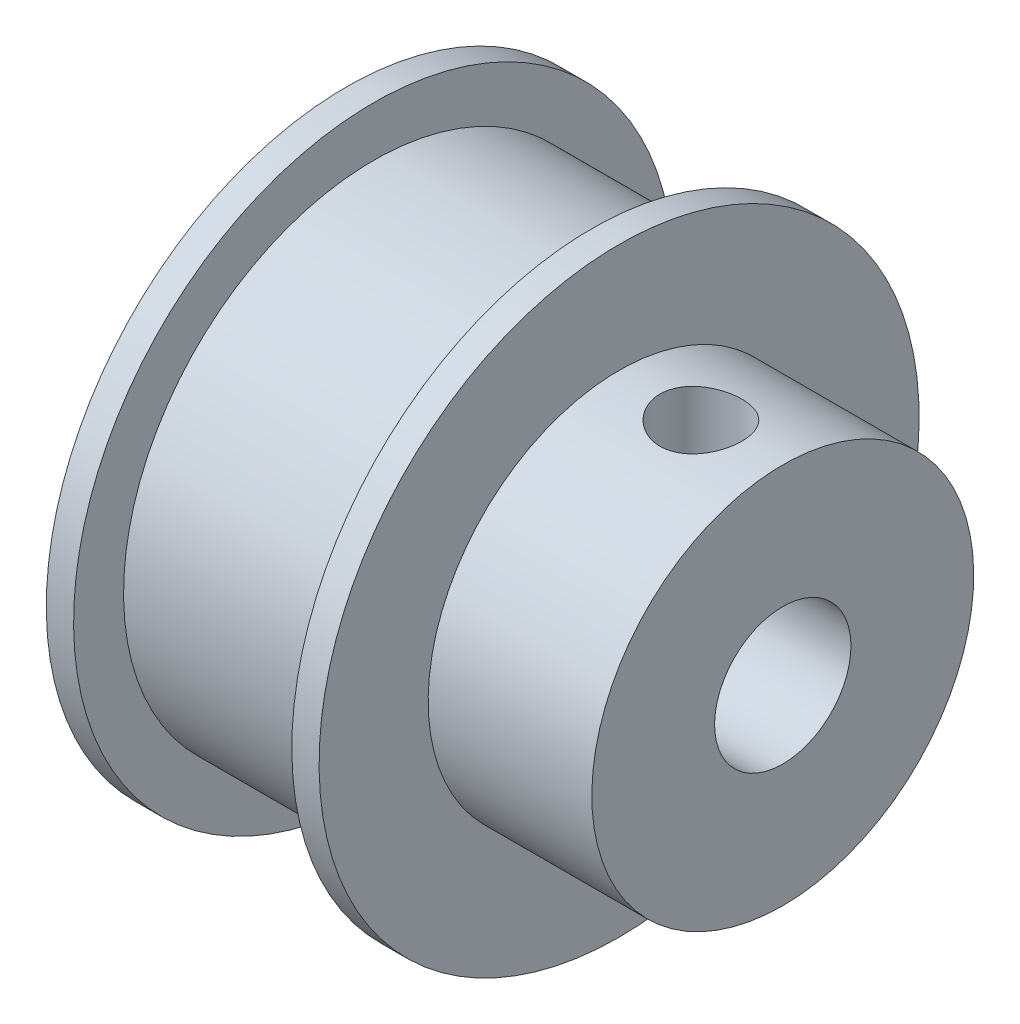
ISO-10303-21;
HEADER;
FILE_DESCRIPTION(('STEP AP214'),'2;1');
FILE_NAME('part.step','',(''),(''),'','','');
FILE_SCHEMA(('AUTOMOTIVE_DESIGN { 1 0 10303 214 1 1 1 1 }'));
ENDSEC;
DATA;
#1=APPLICATION_CONTEXT('core data for automotive mechanical design processes');
#2=APPLICATION_PROTOCOL_DEFINITION('international standard','automotive_design',2000,#1);
#3=PRODUCT_CONTEXT('',#1,'mechanical');
#4=PRODUCT('Part','Part','',(#3));
#5=PRODUCT_RELATED_PRODUCT_CATEGORY('part','',(#4));
#6=PRODUCT_DEFINITION_FORMATION('','',#4);
#7=PRODUCT_DEFINITION_CONTEXT('part definition',#1,'design');
#8=PRODUCT_DEFINITION('design','',#6,#7);
#9=PRODUCT_DEFINITION_SHAPE('','',#8);
#10=(LENGTH_UNIT() NAMED_UNIT(*) SI_UNIT(.MILLI.,.METRE.));
#11=(NAMED_UNIT(*) PLANE_ANGLE_UNIT() SI_UNIT($,.RADIAN.));
#12=(NAMED_UNIT(*) SI_UNIT($,.STERADIAN.) SOLID_ANGLE_UNIT());
#13=UNCERTAINTY_MEASURE_WITH_UNIT(LENGTH_MEASURE(1.E-05),#10,'distance_accuracy_value','');
#14=(GEOMETRIC_REPRESENTATION_CONTEXT(3) GLOBAL_UNCERTAINTY_ASSIGNED_CONTEXT((#13)) GLOBAL_UNIT_ASSIGNED_CONTEXT((#10,
#11,#12)) REPRESENTATION_CONTEXT('',''));
#15=CARTESIAN_POINT('',(0.,0.,0.));
#16=DIRECTION('',(0.,0.,1.));
#17=DIRECTION('',(1.,0.,0.));
#18=AXIS2_PLACEMENT_3D('',#15,#16,#17);
#19=CARTESIAN_POINT('',(16.0077,11.0077,11.007649774016));
#20=DIRECTION('',(-1.,0.,0.));
#21=DIRECTION('',(0.,-1.,0.));
#22=AXIS2_PLACEMENT_3D('',#19,#20,#21);
#23=PLANE('',#22);
#24=CARTESIAN_POINT('',(16.0077,11.0077,11.007649774016));
#25=DIRECTION('',(-1.,0.,0.));
#26=DIRECTION('',(0.,-1.,0.));
#27=AXIS2_PLACEMENT_3D('',#24,#25,#26);
#28=CIRCLE('',#27,2.5);
#29=CARTESIAN_POINT('',(16.0077,8.5077,11.007649774016));
#30=VERTEX_POINT('',#29);
#31=EDGE_CURVE('E17',#30,#30,#28,.F.);
#32=ORIENTED_EDGE('',*,*,#31,.F.);
#33=EDGE_LOOP('',(#32));
#34=FACE_BOUND('',#33,.T.);
#35=CARTESIAN_POINT('',(16.0077,11.0077,11.007649774016));
#36=DIRECTION('',(-1.,0.,0.));
#37=DIRECTION('',(0.,-1.,0.));
#38=AXIS2_PLACEMENT_3D('',#35,#36,#37);
#39=CIRCLE('',#38,7.);
#40=CARTESIAN_POINT('',(16.0077,4.0077,11.007649774016));
#41=VERTEX_POINT('',#40);
#42=EDGE_CURVE('E54',#41,#41,#39,.T.);
#43=ORIENTED_EDGE('',*,*,#42,.F.);
#44=EDGE_LOOP('',(#43));
#45=FACE_BOUND('',#44,.T.);
#46=ADVANCED_FACE('F13',(#34,#45),#23,.F.);
#47=CARTESIAN_POINT('',(13.0077,18.0077,11.007649774016));
#48=DIRECTION('',(0.,-1.,0.));
#49=DIRECTION('',(0.,0.,-1.));
#50=AXIS2_PLACEMENT_3D('',#47,#48,#49);
#51=CYLINDRICAL_SURFACE('',#50,1.5);
#52=CARTESIAN_POINT('',(11.5077,18.0077,11.007649774016));
#53=CARTESIAN_POINT('',(11.5077040616329,18.0076979158203,10.9245031964725));
#54=CARTESIAN_POINT('',(11.5146433516276,18.0062019794075,10.8412548351576));
#55=CARTESIAN_POINT('',(11.5422101351377,18.0003737217559,10.6770511501405));
#56=CARTESIAN_POINT('',(11.5628643761845,17.9960358582811,10.5961006301142));
#57=CARTESIAN_POINT('',(11.6171882271792,17.9850075156425,10.4389922217525));
#58=CARTESIAN_POINT('',(11.6508383681662,17.9783205569708,10.3628273616013));
#59=CARTESIAN_POINT('',(11.7301467464749,17.9633187697261,10.2172515725692));
#60=CARTESIAN_POINT('',(11.7758012455401,17.9550044481331,10.1478385503125));
#61=CARTESIAN_POINT('',(11.8785789047546,17.9375139278232,10.016626975165));
#62=CARTESIAN_POINT('',(11.9358531333075,17.928327326067,9.95494811933814));
#63=CARTESIAN_POINT('',(12.059922718787,17.9102011803762,9.84199205710669));
#64=CARTESIAN_POINT('',(12.1267194075848,17.9012616712107,9.79071630818108));
#65=CARTESIAN_POINT('',(12.2688060531835,17.8845411249014,9.69950755199408));
#66=CARTESIAN_POINT('',(12.344178147649,17.8767732986043,9.65969986222468));
#67=CARTESIAN_POINT('',(12.5007351303334,17.8634232089553,9.59336131193178));
#68=CARTESIAN_POINT('',(12.5819193037601,17.8578406773918,9.5668288219679));
#69=CARTESIAN_POINT('',(12.7465110264519,17.849598092299,9.52818404486148));
#70=CARTESIAN_POINT('',(12.8298671533579,17.8468955729071,9.51586199436955));
#71=CARTESIAN_POINT('',(12.997504109287,17.8445913979369,9.50533581953319));
#72=CARTESIAN_POINT('',(13.081784829579,17.8449893815645,9.50713005252928));
#73=CARTESIAN_POINT('',(13.2473243868107,17.8488027590592,9.52461647726507));
#74=CARTESIAN_POINT('',(13.3286102915488,17.8521653920302,9.5400656682123));
#75=CARTESIAN_POINT('',(13.4874096692655,17.8614458901697,9.5840390267379));
#76=CARTESIAN_POINT('',(13.5649229102641,17.8673639122478,9.61256399722121));
#77=CARTESIAN_POINT('',(13.714665573432,17.881141056491,9.68210549661695));
#78=CARTESIAN_POINT('',(13.7868497022893,17.8890147777161,9.72321654188413));
#79=CARTESIAN_POINT('',(13.923379811785,17.9058063671576,9.81669355832473));
#80=CARTESIAN_POINT('',(13.987725326843,17.9147242973338,9.86906019752274));
#81=CARTESIAN_POINT('',(14.1081465904722,17.9328252701469,9.98484177676397));
#82=CARTESIAN_POINT('',(14.164025192974,17.94200999451,10.0484616685418));
#83=CARTESIAN_POINT('',(14.2643751179751,17.9594466989421,10.1843033079118));
#84=CARTESIAN_POINT('',(14.3088414656964,17.967698271362,10.2565287867927));
#85=CARTESIAN_POINT('',(14.3851480171703,17.9823650392561,10.4077865060949));
#86=CARTESIAN_POINT('',(14.4169530610728,17.9887751074254,10.486836969534));
#87=CARTESIAN_POINT('',(14.4667123206038,17.9989885561534,10.6492278042405));
#88=CARTESIAN_POINT('',(14.4846955529901,18.0027973957049,10.7325587944069));
#89=CARTESIAN_POINT('',(14.4995643489133,18.0059604833547,10.8483901194094));
#90=CARTESIAN_POINT('',(14.5026125156616,18.0066113029207,10.8801576267083));
#91=CARTESIAN_POINT('',(14.5066811224727,18.0074814616371,10.9438283474738));
#92=CARTESIAN_POINT('',(14.507701559175,18.0077008000725,10.9757315611653));
#93=CARTESIAN_POINT('',(14.5076959383671,18.0076979158203,11.0907963515595));
#94=CARTESIAN_POINT('',(14.5007566483724,18.0062019794075,11.1740447128744));
#95=CARTESIAN_POINT('',(14.4731898648623,18.0003737217559,11.3382483978915));
#96=CARTESIAN_POINT('',(14.4525356238155,17.9960358582811,11.4191989179178));
#97=CARTESIAN_POINT('',(14.3982117728208,17.9850075156425,11.5763073262795));
#98=CARTESIAN_POINT('',(14.3645616318338,17.9783205569708,11.6524721864307));
#99=CARTESIAN_POINT('',(14.2852532535251,17.9633187697261,11.7980479754628));
#100=CARTESIAN_POINT('',(14.2395987544599,17.9550044481331,11.8674609977195));
#101=CARTESIAN_POINT('',(14.1368210952454,17.9375139278232,11.998672572867));
#102=CARTESIAN_POINT('',(14.0795468666925,17.928327326067,12.0603514286939));
#103=CARTESIAN_POINT('',(13.955477281213,17.9102011803762,12.1733074909253));
#104=CARTESIAN_POINT('',(13.8886805924152,17.9012616712107,12.2245832398509));
#105=CARTESIAN_POINT('',(13.7465939468165,17.8845411249014,12.3157919960379));
#106=CARTESIAN_POINT('',(13.671221852351,17.8767732986043,12.3555996858073));
#107=CARTESIAN_POINT('',(13.5146648696666,17.8634232089553,12.4219382361002));
#108=CARTESIAN_POINT('',(13.4334806962399,17.8578406773918,12.4484707260641));
#109=CARTESIAN_POINT('',(13.2688889735481,17.849598092299,12.4871155031705));
#110=CARTESIAN_POINT('',(13.1855328466421,17.8468955729071,12.4994375536624));
#111=CARTESIAN_POINT('',(13.017895890713,17.8445913979369,12.5099637284988));
#112=CARTESIAN_POINT('',(12.9336151704211,17.8449893815645,12.5081694955027));
#113=CARTESIAN_POINT('',(12.7680756131893,17.8488027590592,12.4906830707669));
#114=CARTESIAN_POINT('',(12.6867897084512,17.8521653920302,12.4752338798197));
#115=CARTESIAN_POINT('',(12.5279903307345,17.8614458901697,12.4312605212941));
#116=CARTESIAN_POINT('',(12.4504770897359,17.8673639122478,12.4027355508108));
#117=CARTESIAN_POINT('',(12.300734426568,17.881141056491,12.333194051415));
#118=CARTESIAN_POINT('',(12.2285502977107,17.8890147777161,12.2920830061479));
#119=CARTESIAN_POINT('',(12.092020188215,17.9058063671576,12.1986059897073));
#120=CARTESIAN_POINT('',(12.027674673157,17.9147242973338,12.1462393505093));
#121=CARTESIAN_POINT('',(11.9072534095278,17.9328252701469,12.030457771268));
#122=CARTESIAN_POINT('',(11.851374807026,17.94200999451,11.9668378794902));
#123=CARTESIAN_POINT('',(11.7510248820249,17.9594466989421,11.8309962401202));
#124=CARTESIAN_POINT('',(11.7065585343036,17.967698271362,11.7587707612393));
#125=CARTESIAN_POINT('',(11.6302519828297,17.9823650392561,11.6075130419371));
#126=CARTESIAN_POINT('',(11.5984469389272,17.9887751074254,11.528462578498));
#127=CARTESIAN_POINT('',(11.5486876793962,17.9989885561534,11.3660717437915));
#128=CARTESIAN_POINT('',(11.5307044470099,18.0027973957049,11.2827407536251));
#129=CARTESIAN_POINT('',(11.5158356510867,18.0059604833547,11.1669094286226));
#130=CARTESIAN_POINT('',(11.5127874843384,18.0066113029207,11.1351419213237));
#131=CARTESIAN_POINT('',(11.5087188775273,18.0074814616371,11.0714712005582));
#132=CARTESIAN_POINT('',(11.507698440825,18.0077008000725,11.0395679868667));
#133=CARTESIAN_POINT('',(11.5077,18.0077,11.007649774016));
#134=B_SPLINE_CURVE_WITH_KNOTS('',3,(#52,#53,#54,#55,#56,#57,#58,#59,#60,#61,#62,#63,#64,#65,
#66,#67,#68,#69,#70,#71,#72,#73,#74,#75,#76,#77,#78,#79,#80,#81,#82,#83,#84,#85,#86,#87,#88,#89,
#90,#91,#92,#93,#94,#95,#96,#97,#98,#99,#100,#101,#102,#103,#104,#105,#106,#107,#108,#109,#110,
#111,#112,#113,#114,#115,#116,#117,#118,#119,#120,#121,#122,#123,#124,#125,#126,#127,#128,#129,
#130,#131,#132,#133),.UNSPECIFIED.,.T.,.F.,(4,2,2,2,2,2,2,2,2,2,2,2,2,2,2,2,2,2,2,2,2,2,2,2,2,2,
2,2,2,2,2,2,2,2,2,2,2,2,2,2,4),(0.,0.249317611112429,0.499122886646075,0.748555375291559,
0.997910280399726,1.25074283188275,1.50361078087366,1.75914535611344,2.01464855852494,
2.26632989937654,2.51798195343823,2.7652438496878,3.01252093083651,3.26170250920425,
3.51089888069668,3.76521690193803,4.01964559675176,4.27477598038629,4.5293692830717,
4.62507688314403,4.72078464182782,4.97010225294025,5.2199075284739,5.46934001711938,
5.71869492222755,5.97152747371058,6.22439542270148,6.47992999794126,6.73543320035276,
6.98711454120436,7.23876659526606,7.48602849151562,7.73330557266433,7.98248715103208,
8.2316835225245,8.48600154376585,8.74043023857958,8.9955606222141,9.25015392489952,
9.34586152497186,9.44156928365565),.UNSPECIFIED.);
#135=CARTESIAN_POINT('',(11.5077,18.0077,11.007649774016));
#136=VERTEX_POINT('',#135);
#137=EDGE_CURVE('E46',#136,#136,#134,.T.);
#138=ORIENTED_EDGE('',*,*,#137,.F.);
#139=EDGE_LOOP('',(#138));
#140=FACE_BOUND('',#139,.T.);
#141=CARTESIAN_POINT('',(11.5077,13.5077,11.007649774016));
#142=CARTESIAN_POINT('',(11.5077040910099,13.5076962578973,11.084379607478));
#143=CARTESIAN_POINT('',(11.5136286709263,13.5041290461501,11.1612320946602));
#144=CARTESIAN_POINT('',(11.5370243195153,13.4901990360857,11.3126252835467));
#145=CARTESIAN_POINT('',(11.5545238618542,13.4798194803272,11.387159808612));
#146=CARTESIAN_POINT('',(11.6000863611669,13.4533155805449,11.5314016018068));
#147=CARTESIAN_POINT('',(11.6280969581632,13.4372197327294,11.6011308022426));
#148=CARTESIAN_POINT('',(11.693560333141,13.4006536762641,11.7346800922307));
#149=CARTESIAN_POINT('',(11.7310107669687,13.3801845538026,11.7985016434324));
#150=CARTESIAN_POINT('',(11.8174748267086,13.3347536071909,11.9239490530153));
#151=CARTESIAN_POINT('',(11.8671536953514,13.3095679219599,11.9850337940974));
#152=CARTESIAN_POINT('',(11.9751672038283,13.2580043927963,12.0985324781349));
#153=CARTESIAN_POINT('',(12.0335129371873,13.2316250515357,12.1509351234971));
#154=CARTESIAN_POINT('',(12.1656235104967,13.1768106699591,12.2520997416457));
#155=CARTESIAN_POINT('',(12.2404017709813,13.1485201770365,12.2996274378041));
#156=CARTESIAN_POINT('',(12.3985465732431,13.0970830141212,12.381264151665));
#157=CARTESIAN_POINT('',(12.4818988962476,13.0739280227394,12.4153949473676));
#158=CARTESIAN_POINT('',(12.6342964506532,13.0412462966093,12.4620557911582));
#159=CARTESIAN_POINT('',(12.7019359986103,13.0297788313759,12.4778117464843));
#160=CARTESIAN_POINT('',(12.8395037158304,13.013603082955,12.4998114974207));
#161=CARTESIAN_POINT('',(12.9094289287545,13.0088863964376,12.5060671195844));
#162=CARTESIAN_POINT('',(13.0497114942173,13.0069092246386,12.5087048619761));
#163=CARTESIAN_POINT('',(13.1200694250932,13.0096633701272,12.5050676081002));
#164=CARTESIAN_POINT('',(13.2589787754276,13.0222326144374,12.4881103788043));
#165=CARTESIAN_POINT('',(13.3275287958474,13.0320530243223,12.474783120217));
#166=CARTESIAN_POINT('',(13.4602302421281,13.0572318694426,12.4393889928339));
#167=CARTESIAN_POINT('',(13.5244270539245,13.0725171165254,12.4174372606769));
#168=CARTESIAN_POINT('',(13.6483949909281,13.1069705135083,12.3656003917244));
#169=CARTESIAN_POINT('',(13.7081644834239,13.1261400862346,12.335712346613));
#170=CARTESIAN_POINT('',(13.8326840971228,13.1702532726899,12.2628296058618));
#171=CARTESIAN_POINT('',(13.8964780929549,13.1956204337299,12.2184570179932));
#172=CARTESIAN_POINT('',(14.016376483667,13.2470059976438,12.120560701856));
#173=CARTESIAN_POINT('',(14.0724734339765,13.2730250026215,12.0670282250218));
#174=CARTESIAN_POINT('',(14.1833129818218,13.3270550495832,11.943461608399));
#175=CARTESIAN_POINT('',(14.236777306016,13.3548383626853,11.872167456721));
#176=CARTESIAN_POINT('',(14.3308220471979,13.4054242843398,11.719925824475));
#177=CARTESIAN_POINT('',(14.37140935379,13.4282295542552,11.6389835379596));
#178=CARTESIAN_POINT('',(14.4356321827959,13.4650039206615,11.4748473592842));
#179=CARTESIAN_POINT('',(14.4601753557159,13.479439574397,11.3921173981896));
#180=CARTESIAN_POINT('',(14.4947111974054,13.4998884281355,11.2226976691606));
#181=CARTESIAN_POINT('',(14.5047213177536,13.5059117295274,11.1360127796773));
#182=CARTESIAN_POINT('',(14.5092078476783,13.5086057037461,10.9739351596386));
#183=CARTESIAN_POINT('',(14.5056088550852,13.5064352171429,10.8986073005973));
#184=CARTESIAN_POINT('',(14.4872741469281,13.4954871208705,10.7498203720299));
#185=CARTESIAN_POINT('',(14.4725386571942,13.4867096451804,10.6763612646399));
#186=CARTESIAN_POINT('',(14.4331565671875,13.4636479244219,10.5350748418584));
#187=CARTESIAN_POINT('',(14.4087596509265,13.4495027566256,10.4671540230875));
#188=CARTESIAN_POINT('',(14.3510226236347,13.4168388086284,10.3363840249287));
#189=CARTESIAN_POINT('',(14.3176807486533,13.3983191658651,10.2735358490521));
#190=CARTESIAN_POINT('',(14.2391430207913,13.3561549623736,10.1476435111921));
#191=CARTESIAN_POINT('',(14.1930761709216,13.3321780273988,10.0852556235592));
#192=CARTESIAN_POINT('',(14.0923086065114,13.2824426557473,9.96862374270586));
#193=CARTESIAN_POINT('',(14.0375978451475,13.2566821658636,9.91438937127862));
#194=CARTESIAN_POINT('',(13.9127896099629,13.2021542390989,9.80832980666021));
#195=CARTESIAN_POINT('',(13.8416161145345,13.1734324174629,9.75773957770685));
#196=CARTESIAN_POINT('',(13.6904839754318,13.1198618206671,9.66919738485933));
#197=CARTESIAN_POINT('',(13.6105347061072,13.0950089799769,9.63123210631819));
#198=CARTESIAN_POINT('',(13.4614569776933,13.0575490924052,9.57622398605824));
#199=CARTESIAN_POINT('',(13.3937196876414,13.0434565932873,9.5564335206541));
#200=CARTESIAN_POINT('',(13.2551679219199,13.0217960574354,9.52651313495628));
#201=CARTESIAN_POINT('',(13.1843578556722,13.0142189764272,9.51636982103969));
#202=CARTESIAN_POINT('',(13.041323052403,13.0067044661627,9.50630846984969));
#203=CARTESIAN_POINT('',(12.969094009313,13.0067957644594,9.50642888293731));
#204=CARTESIAN_POINT('',(12.8258055643905,13.0146771789285,9.51698504442272));
#205=CARTESIAN_POINT('',(12.7547468199194,13.0224714813882,9.52742640185841));
#206=CARTESIAN_POINT('',(12.6192115824278,13.0440318524298,9.55724803252687));
#207=CARTESIAN_POINT('',(12.5545829056931,13.0574921180558,9.57617340556249));
#208=CARTESIAN_POINT('',(12.4293627455258,13.0887550196015,9.62201735324607));
#209=CARTESIAN_POINT('',(12.3687727930394,13.1065592904048,9.64893893813121));
#210=CARTESIAN_POINT('',(12.2433801427792,13.1478299055092,9.71475731845868));
#211=CARTESIAN_POINT('',(12.1793588961457,13.1717458758264,9.75485809725847));
#212=CARTESIAN_POINT('',(12.0583199273827,13.2209012703077,9.84389279012516));
#213=CARTESIAN_POINT('',(12.0013080378474,13.2461417720502,9.89283397793802));
#214=CARTESIAN_POINT('',(11.8863490508683,13.2999569029148,10.0075519997587));
#215=CARTESIAN_POINT('',(11.8297689251038,13.3284030866366,10.0747729547021));
#216=CARTESIAN_POINT('',(11.7286021441367,13.3813542887237,10.2191873395704));
#217=CARTESIAN_POINT('',(11.6840197880152,13.4058578931094,10.2963843295145));
#218=CARTESIAN_POINT('',(11.6099141924263,13.4475557865439,10.4565245432146));
#219=CARTESIAN_POINT('',(11.5799719350732,13.4649507747979,10.5392196870588));
#220=CARTESIAN_POINT('',(11.534975304789,13.4913627300125,10.7096764678972));
#221=CARTESIAN_POINT('',(11.519864832143,13.5004112587149,10.7974176743674));
#222=CARTESIAN_POINT('',(11.5110025452913,13.5057200116819,10.9060916770985));
#223=CARTESIAN_POINT('',(11.5097655826939,13.5064611465636,10.9263735149877));
#224=CARTESIAN_POINT('',(11.5081137536291,13.5074516451737,10.9669839533289));
#225=CARTESIAN_POINT('',(11.5076989156791,13.5077009918432,10.9873125553784));
#226=CARTESIAN_POINT('',(11.5077,13.5077,11.007649774016));
#227=B_SPLINE_CURVE_WITH_KNOTS('',3,(#141,#142,#143,#144,#145,#146,#147,#148,#149,#150,#151,
#152,#153,#154,#155,#156,#157,#158,#159,#160,#161,#162,#163,#164,#165,#166,#167,#168,#169,#170,
#171,#172,#173,#174,#175,#176,#177,#178,#179,#180,#181,#182,#183,#184,#185,#186,#187,#188,#189,
#190,#191,#192,#193,#194,#195,#196,#197,#198,#199,#200,#201,#202,#203,#204,#205,#206,#207,#208,
#209,#210,#211,#212,#213,#214,#215,#216,#217,#218,#219,#220,#221,#222,#223,#224,#225,#226),
.UNSPECIFIED.,.T.,.F.,(4,2,2,2,2,2,2,2,2,2,2,2,2,2,2,2,2,2,2,2,2,2,2,2,2,2,2,2,2,2,2,2,2,2,2,2,
2,2,2,2,2,2,4),(0.,0.230102237548648,0.460772627520011,0.690308884600007,0.919788197992273,
1.16681590732472,1.414162579348,1.69183813189807,1.96906040692092,2.17933829855633,
2.38935420916578,2.59978170870726,2.81036753273872,3.01823267593207,3.22617409809869,
3.47046995225163,3.71500044803674,3.99360957884691,4.27206939275325,4.5329679069656,
4.79355286918236,5.01875602722426,5.24395461863455,5.46367785689772,5.68344445659025,
5.92601365818362,6.16886690081836,6.44336762428009,6.71757792616456,6.93257787314692,
7.14727888733319,7.36278425777433,7.57840681155725,7.78364098331142,7.98895251523035,
8.22578610052286,8.46281544370208,8.73854311775519,9.01436946031986,9.28175654462677,
9.54812832184449,9.60911473335177,9.6701032602764),.UNSPECIFIED.);
#228=CARTESIAN_POINT('',(11.5077,13.5077,11.007649774016));
#229=VERTEX_POINT('',#228);
#230=EDGE_CURVE('E116',#229,#229,#227,.T.);
#231=ORIENTED_EDGE('',*,*,#230,.F.);
#232=EDGE_LOOP('',(#231));
#233=FACE_BOUND('',#232,.T.);
#234=ADVANCED_FACE('F55',(#140,#233),#51,.F.);
#235=CARTESIAN_POINT('',(1.0077,11.0077,11.007649774016));
#236=DIRECTION('',(-1.,0.,0.));
#237=DIRECTION('',(0.,-1.,0.));
#238=AXIS2_PLACEMENT_3D('',#235,#236,#237);
#239=CYLINDRICAL_SURFACE('',#238,2.5);
#240=ORIENTED_EDGE('',*,*,#31,.T.);
#241=EDGE_LOOP('',(#240));
#242=FACE_BOUND('',#241,.T.);
#243=CARTESIAN_POINT('',(0.00769999999999981,11.0077,11.007649774016));
#244=DIRECTION('',(-1.,0.,0.));
#245=DIRECTION('',(0.,-1.,0.));
#246=AXIS2_PLACEMENT_3D('',#243,#244,#245);
#247=CIRCLE('',#246,2.5);
#248=CARTESIAN_POINT('',(0.00770000000000009,8.5077,11.007649774016));
#249=VERTEX_POINT('',#248);
#250=EDGE_CURVE('E43',#249,#249,#247,.F.);
#251=ORIENTED_EDGE('',*,*,#250,.F.);
#252=EDGE_LOOP('',(#251));
#253=FACE_BOUND('',#252,.T.);
#254=ORIENTED_EDGE('',*,*,#230,.T.);
#255=EDGE_LOOP('',(#254));
#256=FACE_BOUND('',#255,.T.);
#257=ADVANCED_FACE('F63',(#242,#253,#256),#239,.F.);
#258=CARTESIAN_POINT('',(16.0077,11.0077,11.007649774016));
#259=DIRECTION('',(-1.,0.,0.));
#260=DIRECTION('',(0.,-1.,0.));
#261=AXIS2_PLACEMENT_3D('',#258,#259,#260);
#262=CYLINDRICAL_SURFACE('',#261,7.);
#263=CARTESIAN_POINT('',(10.0077,11.0077,11.007649774016));
#264=DIRECTION('',(-1.,0.,0.));
#265=DIRECTION('',(0.,-1.,0.));
#266=AXIS2_PLACEMENT_3D('',#263,#264,#265);
#267=CIRCLE('',#266,7.);
#268=CARTESIAN_POINT('',(10.0077,4.0077,11.007649774016));
#269=VERTEX_POINT('',#268);
#270=EDGE_CURVE('E40',#269,#269,#267,.F.);
#271=ORIENTED_EDGE('',*,*,#270,.T.);
#272=EDGE_LOOP('',(#271));
#273=FACE_BOUND('',#272,.T.);
#274=ORIENTED_EDGE('',*,*,#137,.T.);
#275=EDGE_LOOP('',(#274));
#276=FACE_BOUND('',#275,.T.);
#277=ORIENTED_EDGE('',*,*,#42,.T.);
#278=EDGE_LOOP('',(#277));
#279=FACE_BOUND('',#278,.T.);
#280=ADVANCED_FACE('F58',(#273,#276,#279),#262,.T.);
#281=CARTESIAN_POINT('',(0.0077,11.0077,11.007649774016));
#282=DIRECTION('',(-1.,0.,0.));
#283=DIRECTION('',(0.,-1.,0.));
#284=AXIS2_PLACEMENT_3D('',#281,#282,#283);
#285=PLANE('',#284);
#286=ORIENTED_EDGE('',*,*,#250,.T.);
#287=EDGE_LOOP('',(#286));
#288=FACE_BOUND('',#287,.T.);
#289=CARTESIAN_POINT('',(0.00769999999999872,11.0077,11.007649774016));
#290=DIRECTION('',(-1.,0.,0.));
#291=DIRECTION('',(0.,-1.,0.));
#292=AXIS2_PLACEMENT_3D('',#289,#290,#291);
#293=CIRCLE('',#292,11.);
#294=CARTESIAN_POINT('',(0.00769999999999994,0.00770000000000111,11.007649774016));
#295=VERTEX_POINT('',#294);
#296=EDGE_CURVE('E37',#295,#295,#293,.F.);
#297=ORIENTED_EDGE('',*,*,#296,.F.);
#298=EDGE_LOOP('',(#297));
#299=FACE_BOUND('',#298,.T.);
#300=ADVANCED_FACE('F62',(#288,#299),#285,.T.);
#301=CARTESIAN_POINT('',(10.0077,11.0077,11.007649774016));
#302=DIRECTION('',(-1.,0.,0.));
#303=DIRECTION('',(0.,-1.,0.));
#304=AXIS2_PLACEMENT_3D('',#301,#302,#303);
#305=PLANE('',#304);
#306=ORIENTED_EDGE('',*,*,#270,.F.);
#307=EDGE_LOOP('',(#306));
#308=FACE_BOUND('',#307,.T.);
#309=CARTESIAN_POINT('',(10.0077,11.0077,11.007649774016));
#310=DIRECTION('',(-1.,0.,0.));
#311=DIRECTION('',(0.,-1.,0.));
#312=AXIS2_PLACEMENT_3D('',#309,#310,#311);
#313=CIRCLE('',#312,11.);
#314=CARTESIAN_POINT('',(10.0077,0.00770000000000111,11.007649774016));
#315=VERTEX_POINT('',#314);
#316=EDGE_CURVE('E34',#315,#315,#313,.T.);
#317=ORIENTED_EDGE('',*,*,#316,.F.);
#318=EDGE_LOOP('',(#317));
#319=FACE_BOUND('',#318,.T.);
#320=ADVANCED_FACE('F96',(#308,#319),#305,.F.);
#321=CARTESIAN_POINT('',(1.0077,11.0077,11.007649774016));
#322=DIRECTION('',(-1.,0.,0.));
#323=DIRECTION('',(0.,-1.,0.));
#324=AXIS2_PLACEMENT_3D('',#321,#322,#323);
#325=CYLINDRICAL_SURFACE('',#324,11.);
#326=CARTESIAN_POINT('',(1.0077,11.0077,11.007649774016));
#327=DIRECTION('',(-1.,0.,0.));
#328=DIRECTION('',(0.,-1.,0.));
#329=AXIS2_PLACEMENT_3D('',#326,#327,#328);
#330=CIRCLE('',#329,11.);
#331=CARTESIAN_POINT('',(1.0077,0.00770000000000111,11.007649774016));
#332=VERTEX_POINT('',#331);
#333=EDGE_CURVE('E31',#332,#332,#330,.T.);
#334=ORIENTED_EDGE('',*,*,#333,.T.);
#335=EDGE_LOOP('',(#334));
#336=FACE_BOUND('',#335,.T.);
#337=ORIENTED_EDGE('',*,*,#296,.T.);
#338=EDGE_LOOP('',(#337));
#339=FACE_BOUND('',#338,.T.);
#340=ADVANCED_FACE('F93',(#336,#339),#325,.T.);
#341=CARTESIAN_POINT('',(10.0077,11.0077,11.007649774016));
#342=DIRECTION('',(-1.,0.,0.));
#343=DIRECTION('',(0.,-1.,0.));
#344=AXIS2_PLACEMENT_3D('',#341,#342,#343);
#345=CYLINDRICAL_SURFACE('',#344,11.);
#346=ORIENTED_EDGE('',*,*,#316,.T.);
#347=EDGE_LOOP('',(#346));
#348=FACE_BOUND('',#347,.T.);
#349=CARTESIAN_POINT('',(9.0077,11.0077,11.007649774016));
#350=DIRECTION('',(-1.,0.,0.));
#351=DIRECTION('',(0.,-1.,0.));
#352=AXIS2_PLACEMENT_3D('',#349,#350,#351);
#353=CIRCLE('',#352,11.);
#354=CARTESIAN_POINT('',(9.0077,0.00770000000000111,11.007649774016));
#355=VERTEX_POINT('',#354);
#356=EDGE_CURVE('E26',#355,#355,#353,.T.);
#357=ORIENTED_EDGE('',*,*,#356,.F.);
#358=EDGE_LOOP('',(#357));
#359=FACE_BOUND('',#358,.T.);
#360=ADVANCED_FACE('F89',(#348,#359),#345,.T.);
#361=CARTESIAN_POINT('',(1.0077,11.0077,11.007649774016));
#362=DIRECTION('',(-1.,0.,0.));
#363=DIRECTION('',(0.,-1.,0.));
#364=AXIS2_PLACEMENT_3D('',#361,#362,#363);
#365=PLANE('',#364);
#366=CARTESIAN_POINT('',(1.0077,11.0077,11.007649774016));
#367=DIRECTION('',(-1.,0.,0.));
#368=DIRECTION('',(0.,-1.,0.));
#369=AXIS2_PLACEMENT_3D('',#366,#367,#368);
#370=CIRCLE('',#369,9.168296585514);
#371=CARTESIAN_POINT('',(1.0077,1.839403414486,11.007649774016));
#372=VERTEX_POINT('',#371);
#373=EDGE_CURVE('E21',#372,#372,#370,.F.);
#374=ORIENTED_EDGE('',*,*,#373,.F.);
#375=EDGE_LOOP('',(#374));
#376=FACE_BOUND('',#375,.T.);
#377=ORIENTED_EDGE('',*,*,#333,.F.);
#378=EDGE_LOOP('',(#377));
#379=FACE_BOUND('',#378,.T.);
#380=ADVANCED_FACE('F82',(#376,#379),#365,.F.);
#381=CARTESIAN_POINT('',(9.0077,11.0077,11.007649774016));
#382=DIRECTION('',(-1.,0.,0.));
#383=DIRECTION('',(0.,-1.,0.));
#384=AXIS2_PLACEMENT_3D('',#381,#382,#383);
#385=PLANE('',#384);
#386=CARTESIAN_POINT('',(9.0077,11.0077,11.007649774016));
#387=DIRECTION('',(-1.,0.,0.));
#388=DIRECTION('',(0.,-1.,0.));
#389=AXIS2_PLACEMENT_3D('',#386,#387,#388);
#390=CIRCLE('',#389,9.168296585514);
#391=CARTESIAN_POINT('',(9.0077,1.839403414486,11.007649774016));
#392=VERTEX_POINT('',#391);
#393=EDGE_CURVE('E8',#392,#392,#390,.T.);
#394=ORIENTED_EDGE('',*,*,#393,.F.);
#395=EDGE_LOOP('',(#394));
#396=FACE_BOUND('',#395,.T.);
#397=ORIENTED_EDGE('',*,*,#356,.T.);
#398=EDGE_LOOP('',(#397));
#399=FACE_BOUND('',#398,.T.);
#400=ADVANCED_FACE('F77',(#396,#399),#385,.T.);
#401=CARTESIAN_POINT('',(9.0077,11.0077,11.007649774016));
#402=DIRECTION('',(-1.,0.,0.));
#403=DIRECTION('',(0.,-1.,0.));
#404=AXIS2_PLACEMENT_3D('',#401,#402,#403);
#405=CYLINDRICAL_SURFACE('',#404,9.168296585514);
#406=ORIENTED_EDGE('',*,*,#393,.T.);
#407=EDGE_LOOP('',(#406));
#408=FACE_BOUND('',#407,.T.);
#409=ORIENTED_EDGE('',*,*,#373,.T.);
#410=EDGE_LOOP('',(#409));
#411=FACE_BOUND('',#410,.T.);
#412=ADVANCED_FACE('F75',(#408,#411),#405,.T.);
#413=CLOSED_SHELL('',(#46,#234,#257,#280,#300,#320,#340,#360,#380,#400,#412));
#414=MANIFOLD_SOLID_BREP('B1',#413);
#415=ADVANCED_BREP_SHAPE_REPRESENTATION('',(#18,#414),#14);
#416=SHAPE_DEFINITION_REPRESENTATION(#9,#415);
ENDSEC;
END-ISO-10303-21;
